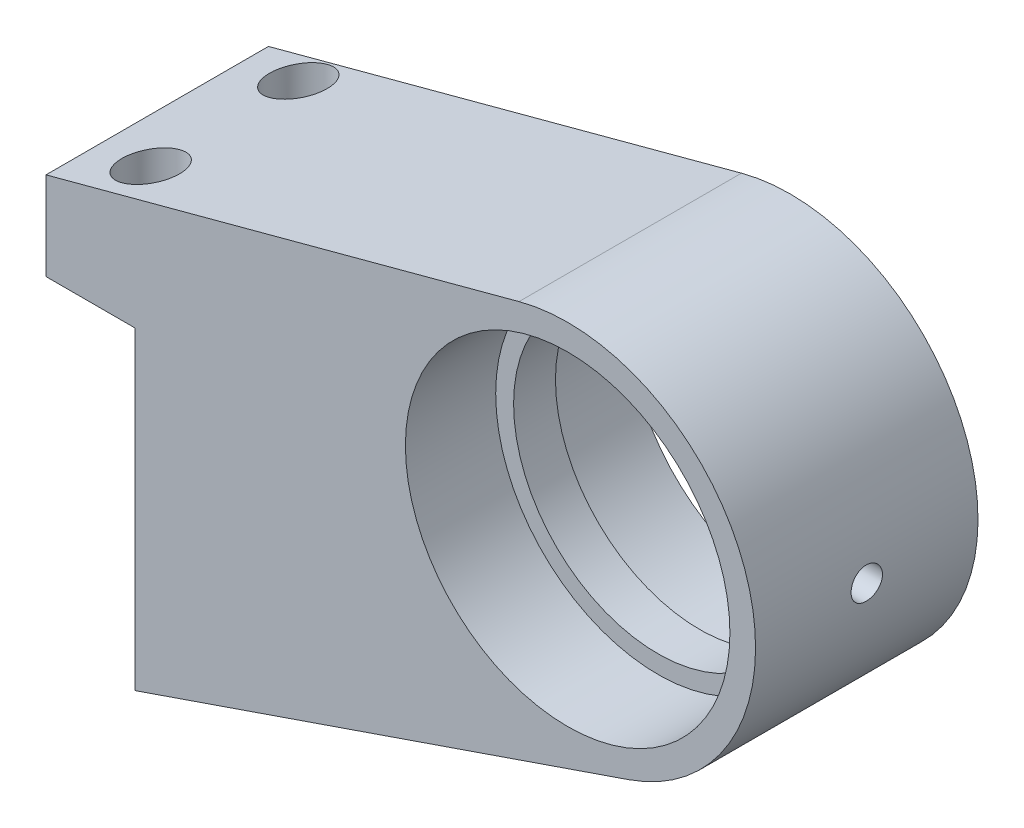
ISO-10303-21;
HEADER;
FILE_DESCRIPTION(('STEP AP214'),'2;1');
FILE_NAME('part.step','',(''),(''),'','','');
FILE_SCHEMA(('AUTOMOTIVE_DESIGN { 1 0 10303 214 1 1 1 1 }'));
ENDSEC;
DATA;
#1=APPLICATION_CONTEXT('core data for automotive mechanical design processes');
#2=APPLICATION_PROTOCOL_DEFINITION('international standard','automotive_design',2000,#1);
#3=PRODUCT_CONTEXT('',#1,'mechanical');
#4=PRODUCT('Part','Part','',(#3));
#5=PRODUCT_RELATED_PRODUCT_CATEGORY('part','',(#4));
#6=PRODUCT_DEFINITION_FORMATION('','',#4);
#7=PRODUCT_DEFINITION_CONTEXT('part definition',#1,'design');
#8=PRODUCT_DEFINITION('design','',#6,#7);
#9=PRODUCT_DEFINITION_SHAPE('','',#8);
#10=(LENGTH_UNIT() NAMED_UNIT(*) SI_UNIT(.MILLI.,.METRE.));
#11=(NAMED_UNIT(*) PLANE_ANGLE_UNIT() SI_UNIT($,.RADIAN.));
#12=(NAMED_UNIT(*) SI_UNIT($,.STERADIAN.) SOLID_ANGLE_UNIT());
#13=UNCERTAINTY_MEASURE_WITH_UNIT(LENGTH_MEASURE(1.E-05),#10,'distance_accuracy_value','');
#14=(GEOMETRIC_REPRESENTATION_CONTEXT(3) GLOBAL_UNCERTAINTY_ASSIGNED_CONTEXT((#13)) GLOBAL_UNIT_ASSIGNED_CONTEXT((#10,
#11,#12)) REPRESENTATION_CONTEXT('',''));
#15=CARTESIAN_POINT('',(0.,0.,0.));
#16=DIRECTION('',(0.,0.,1.));
#17=DIRECTION('',(1.,0.,0.));
#18=AXIS2_PLACEMENT_3D('',#15,#16,#17);
#19=CARTESIAN_POINT('',(0.,0.,21.25));
#20=DIRECTION('',(0.,0.,-1.));
#21=DIRECTION('',(-1.,0.,0.));
#22=AXIS2_PLACEMENT_3D('',#19,#20,#21);
#23=CYLINDRICAL_SURFACE('',#22,35.8999999999999);
#24=CARTESIAN_POINT('',(0.,0.,-21.25));
#25=DIRECTION('',(0.,0.,1.));
#26=DIRECTION('',(-1.,0.,0.));
#27=AXIS2_PLACEMENT_3D('',#24,#25,#26);
#28=CIRCLE('',#27,35.8999999999999);
#29=CARTESIAN_POINT('',(11.6701220456438,-33.9502319791746,-21.25));
#30=VERTEX_POINT('',#29);
#31=CARTESIAN_POINT('',(-9.29160371918065,34.6767371637774,-21.25));
#32=VERTEX_POINT('',#31);
#33=EDGE_CURVE('E95',#30,#32,#28,.T.);
#34=ORIENTED_EDGE('',*,*,#33,.T.);
#35=DIRECTION('',(0.,0.,-1.));
#36=VECTOR('',#35,1.);
#37=CARTESIAN_POINT('',(-9.29160371918065,34.6767371637774,21.25));
#38=LINE('',#37,#36);
#39=CARTESIAN_POINT('',(-9.29160371918065,34.6767371637774,21.25));
#40=VERTEX_POINT('',#39);
#41=EDGE_CURVE('E139',#40,#32,#38,.T.);
#42=ORIENTED_EDGE('',*,*,#41,.F.);
#43=CARTESIAN_POINT('',(0.,0.,21.25));
#44=DIRECTION('',(0.,0.,1.));
#45=DIRECTION('',(-1.,0.,0.));
#46=AXIS2_PLACEMENT_3D('',#43,#44,#45);
#47=CIRCLE('',#46,35.8999999999999);
#48=CARTESIAN_POINT('',(11.6701220456438,-33.9502319791746,21.25));
#49=VERTEX_POINT('',#48);
#50=EDGE_CURVE('E71',#49,#40,#47,.T.);
#51=ORIENTED_EDGE('',*,*,#50,.F.);
#52=DIRECTION('',(0.,0.,-1.));
#53=VECTOR('',#52,1.);
#54=CARTESIAN_POINT('',(11.6701220456438,-33.9502319791746,21.25));
#55=LINE('',#54,#53);
#56=EDGE_CURVE('E135',#49,#30,#55,.T.);
#57=ORIENTED_EDGE('',*,*,#56,.T.);
#58=EDGE_LOOP('',(#34,#42,#51,#57));
#59=FACE_BOUND('',#58,.T.);
#60=CARTESIAN_POINT('',(35.8999999999999,0.,3.));
#61=CARTESIAN_POINT('',(35.8999983581008,-0.168196528062738,2.99999265434154));
#62=CARTESIAN_POINT('',(35.8988053630525,-0.33650751519791,2.98580738391814));
#63=CARTESIAN_POINT('',(35.8941609724885,-0.668472546397986,2.92942846763336));
#64=CARTESIAN_POINT('',(35.8907070193265,-0.832121097171492,2.88720310140622));
#65=CARTESIAN_POINT('',(35.8819310207019,-1.14990533508519,2.7759736788079));
#66=CARTESIAN_POINT('',(35.8766100333074,-1.30404635219412,2.7069847872775));
#67=CARTESIAN_POINT('',(35.8646966645907,-1.59852376156954,2.5442138124416));
#68=CARTESIAN_POINT('',(35.8581045550644,-1.73886309529143,2.45043702778465));
#69=CARTESIAN_POINT('',(35.8443697584854,-2.00214980806945,2.24049279425437));
#70=CARTESIAN_POINT('',(35.837225854699,-2.12505695337023,2.12427496419508));
#71=CARTESIAN_POINT('',(35.8232028398922,-2.34964519784364,1.87285408776642));
#72=CARTESIAN_POINT('',(35.8163237405228,-2.45132536392633,1.73765020725006));
#73=CARTESIAN_POINT('',(35.8035961226238,-2.63070955377057,1.45185150199227));
#74=CARTESIAN_POINT('',(35.7977491297785,-2.70837820839657,1.30123440372215));
#75=CARTESIAN_POINT('',(35.7877616711775,-2.83730871028185,0.989039946665077));
#76=CARTESIAN_POINT('',(35.7836211751275,-2.88857102631902,0.827462782504051));
#77=CARTESIAN_POINT('',(35.7775257367111,-2.96311698654935,0.498337940952735));
#78=CARTESIAN_POINT('',(35.775565674242,-2.98646618610557,0.330805208072192));
#79=CARTESIAN_POINT('',(35.7740368446109,-3.00472563572702,-0.00581204807895169));
#80=CARTESIAN_POINT('',(35.7744680323432,-2.9996364222213,-0.174896542018879));
#81=CARTESIAN_POINT('',(35.7776683320774,-2.96121768905545,-0.509368348073819));
#82=CARTESIAN_POINT('',(35.7804315454105,-2.92795941996716,-0.674763908634743));
#83=CARTESIAN_POINT('',(35.7879752966316,-2.83425735252202,-0.997616989025964));
#84=CARTESIAN_POINT('',(35.7927558543185,-2.77381328735283,-1.1550744309315));
#85=CARTESIAN_POINT('',(35.8038024287285,-2.6273756523904,-1.45780866687739));
#86=CARTESIAN_POINT('',(35.8100703017665,-2.54135012017757,-1.6030699296752));
#87=CARTESIAN_POINT('',(35.82338355671,-2.34621454229857,-1.87711852357911));
#88=CARTESIAN_POINT('',(35.8304289544495,-2.23710402647208,-2.00590551907632));
#89=CARTESIAN_POINT('',(35.8445296523294,-1.99849612477506,-2.24376407056826));
#90=CARTESIAN_POINT('',(35.8515849164053,-1.8689371425196,-2.35277384782563));
#91=CARTESIAN_POINT('',(35.864889771102,-1.59332489395989,-2.5475058983474));
#92=CARTESIAN_POINT('',(35.8711393611806,-1.44727161655407,-2.63322815593788));
#93=CARTESIAN_POINT('',(35.8821299072818,-1.14277650693505,-2.77894799771445));
#94=CARTESIAN_POINT('',(35.8868707025294,-0.984333356713696,-2.83894284065969));
#95=CARTESIAN_POINT('',(35.8943076572108,-0.659574576064503,-2.93146153933016));
#96=CARTESIAN_POINT('',(35.897003859315,-0.493259110007749,-2.96398596836067));
#97=CARTESIAN_POINT('',(35.9000423604596,-0.15801226704986,-3.0005631217943));
#98=CARTESIAN_POINT('',(35.9003917142211,0.010909738561257,-3.00470117757844));
#99=CARTESIAN_POINT('',(35.8987159984715,0.34704509273227,-2.9846116660424));
#100=CARTESIAN_POINT('',(35.8966909512338,0.514258457305466,-2.96038436480736));
#101=CARTESIAN_POINT('',(35.890498709143,0.841986606447021,-2.88432258954828));
#102=CARTESIAN_POINT('',(35.8863345839984,1.00251063470026,-2.83252767291312));
#103=CARTESIAN_POINT('',(35.8763319643611,1.31258976827225,-2.70284134136168));
#104=CARTESIAN_POINT('',(35.8704934432533,1.46214469918688,-2.62494951162485));
#105=CARTESIAN_POINT('',(35.8577789292513,1.74642861467343,-2.44506601571362));
#106=CARTESIAN_POINT('',(35.8509005169244,1.88112172295302,-2.34301782509544));
#107=CARTESIAN_POINT('',(35.836887117496,2.1314963874958,-2.11780002589673));
#108=CARTESIAN_POINT('',(35.8297521259135,2.24717761153615,-1.99463004830072));
#109=CARTESIAN_POINT('',(35.8160088409483,2.4565374853733,-1.7302947105824));
#110=CARTESIAN_POINT('',(35.8094019078717,2.55016044721543,-1.58908516374868));
#111=CARTESIAN_POINT('',(35.7974820694115,2.71236433619843,-1.29289903190053));
#112=CARTESIAN_POINT('',(35.7921691510464,2.78094551456125,-1.13792258501655));
#113=CARTESIAN_POINT('',(35.7834465232229,2.89102423141862,-0.81879897088261));
#114=CARTESIAN_POINT('',(35.7800344198639,2.9325558475408,-0.65466362649774));
#115=CARTESIAN_POINT('',(35.7754917409488,2.98746745470122,-0.321719546728758));
#116=CARTESIAN_POINT('',(35.774361121307,3.0008479897126,-0.152910901712324));
#117=CARTESIAN_POINT('',(35.7745100677143,2.99907130857983,0.184034486825127));
#118=CARTESIAN_POINT('',(35.7757822440027,2.98400159079879,0.352171701905142));
#119=CARTESIAN_POINT('',(35.7805777373763,2.92593464038135,0.683518282301407));
#120=CARTESIAN_POINT('',(35.784101057885,2.88293736527268,0.84672764012297));
#121=CARTESIAN_POINT('',(35.7929999027409,2.77025802096645,1.16359122139991));
#122=CARTESIAN_POINT('',(35.798375316818,2.70057754040981,1.3172460130736));
#123=CARTESIAN_POINT('',(35.8103728493766,2.53651956739625,1.6106907832731));
#124=CARTESIAN_POINT('',(35.8169949484507,2.44214245939094,1.75048097758195));
#125=CARTESIAN_POINT('',(35.8307639244259,2.23104150936917,2.01267618679172));
#126=CARTESIAN_POINT('',(35.8379122847306,2.11425288259286,2.13502896358499));
#127=CARTESIAN_POINT('',(35.8519148030587,1.86176171833654,2.3584449589874));
#128=CARTESIAN_POINT('',(35.8587688894855,1.72605461172823,2.45950301971482));
#129=CARTESIAN_POINT('',(35.8714230113343,1.43931580726634,2.63759716101621));
#130=CARTESIAN_POINT('',(35.8772210522299,1.2882559340769,2.71458797878195));
#131=CARTESIAN_POINT('',(35.8870864246863,0.975407600454834,2.8420141763684));
#132=CARTESIAN_POINT('',(35.8911557441464,0.813631711545144,2.8924800737844));
#133=CARTESIAN_POINT('',(35.8960608059989,0.542418329090169,2.95257473992635));
#134=CARTESIAN_POINT('',(35.8975312767781,0.434724905889867,2.9703355655539));
#135=CARTESIAN_POINT('',(35.8995014047067,0.218037021808156,2.99405056092623));
#136=CARTESIAN_POINT('',(35.9000010644505,0.109042564404451,3.00000476222336));
#137=CARTESIAN_POINT('',(35.8999999999999,0.,3.));
#138=B_SPLINE_CURVE_WITH_KNOTS('',3,(#60,#61,#62,#63,#64,#65,#66,#67,#68,#69,#70,#71,#72,#73,
#74,#75,#76,#77,#78,#79,#80,#81,#82,#83,#84,#85,#86,#87,#88,#89,#90,#91,#92,#93,#94,#95,#96,#97,
#98,#99,#100,#101,#102,#103,#104,#105,#106,#107,#108,#109,#110,#111,#112,#113,#114,#115,#116,
#117,#118,#119,#120,#121,#122,#123,#124,#125,#126,#127,#128,#129,#130,#131,#132,#133,#134,#135,
#136,#137),.UNSPECIFIED.,.T.,.F.,(4,2,2,2,2,2,2,2,2,2,2,2,2,2,2,2,2,2,2,2,2,2,2,2,2,2,2,2,2,2,2,
2,2,2,2,2,2,2,4),(0.,0.504191458804995,1.00895425819109,1.51343146390841,2.01780091989622,
2.52331615795901,3.02885361264998,3.5351322182455,4.04140183583244,4.54648010303825,
5.05154884306913,5.55534386853372,6.05914383855318,6.56357593852548,7.06801831300295,
7.57401027346526,8.0800025744903,8.5860487753091,9.09208441472444,9.59659820717055,
10.1011072669933,10.6048943394815,11.1086894202406,11.613675212063,12.118669827313,
12.6249260012533,13.1311770962361,13.6367891650157,14.1423914635874,14.6464413218599,
15.1504919466938,15.6545125664749,16.1585253406499,16.6640176254706,17.1696322072979,
17.6761920462652,18.182167792402,18.5090382526806,18.8359078394203),.UNSPECIFIED.);
#139=CARTESIAN_POINT('',(35.8999999999999,0.,3.));
#140=VERTEX_POINT('',#139);
#141=EDGE_CURVE('E292',#140,#140,#138,.T.);
#142=ORIENTED_EDGE('',*,*,#141,.F.);
#143=EDGE_LOOP('',(#142));
#144=FACE_BOUND('',#143,.T.);
#145=ADVANCED_FACE('F41',(#59,#144),#23,.T.);
#146=CARTESIAN_POINT('',(0.,0.,-4.));
#147=DIRECTION('',(0.,0.,1.));
#148=DIRECTION('',(1.,0.,0.));
#149=AXIS2_PLACEMENT_3D('',#146,#147,#148);
#150=CYLINDRICAL_SURFACE('',#149,27.58);
#151=CARTESIAN_POINT('',(0.,0.,4.));
#152=DIRECTION('',(0.,0.,-1.));
#153=DIRECTION('',(-1.,0.,0.));
#154=AXIS2_PLACEMENT_3D('',#151,#152,#153);
#155=CIRCLE('',#154,27.58);
#156=CARTESIAN_POINT('',(-27.58,0.,4.));
#157=VERTEX_POINT('',#156);
#158=EDGE_CURVE('E298',#157,#157,#155,.T.);
#159=ORIENTED_EDGE('',*,*,#158,.F.);
#160=EDGE_LOOP('',(#159));
#161=FACE_BOUND('',#160,.T.);
#162=CARTESIAN_POINT('',(0.,0.,-4.));
#163=DIRECTION('',(0.,0.,-1.));
#164=DIRECTION('',(-1.,0.,0.));
#165=AXIS2_PLACEMENT_3D('',#162,#163,#164);
#166=CIRCLE('',#165,27.58);
#167=CARTESIAN_POINT('',(-27.58,0.,-4.));
#168=VERTEX_POINT('',#167);
#169=EDGE_CURVE('E299',#168,#168,#166,.T.);
#170=ORIENTED_EDGE('',*,*,#169,.T.);
#171=EDGE_LOOP('',(#170));
#172=FACE_BOUND('',#171,.T.);
#173=CARTESIAN_POINT('',(27.58,0.,-3.));
#174=CARTESIAN_POINT('',(27.5799979169126,0.167978956027762,-2.99999276752933));
#175=CARTESIAN_POINT('',(27.5784490844313,0.336066990395113,-2.98584401120659));
#176=CARTESIAN_POINT('',(27.5724194323365,0.667577376047584,-2.92961861497622));
#177=CARTESIAN_POINT('',(27.5679354375121,0.830994474354692,-2.88751172971104));
#178=CARTESIAN_POINT('',(27.5565412925159,1.14831481021447,-2.77661527983911));
#179=CARTESIAN_POINT('',(27.549632662861,1.30222393935287,-2.70784243494134));
#180=CARTESIAN_POINT('',(27.5341604053286,1.59628278129557,-2.54560013057423));
#181=CARTESIAN_POINT('',(27.5255970918231,1.73643510012817,-2.45213536106389));
#182=CARTESIAN_POINT('',(27.5077332619421,1.99962574548935,-2.24273947679386));
#183=CARTESIAN_POINT('',(27.4984300949535,2.12259774752127,-2.12672521657018));
#184=CARTESIAN_POINT('',(27.4801568191504,2.34736656558619,-1.8757014273155));
#185=CARTESIAN_POINT('',(27.4711867262493,2.44916237095013,-1.74069099217587));
#186=CARTESIAN_POINT('',(27.4545685551073,2.6289285085869,-1.45508640799281));
#187=CARTESIAN_POINT('',(27.4469238705437,2.70683806100302,-1.30445378828163));
#188=CARTESIAN_POINT('',(27.4338557704664,2.83623202961905,-0.992146736531255));
#189=CARTESIAN_POINT('',(27.4284322905915,2.88771721149684,-0.830472624586383));
#190=CARTESIAN_POINT('',(27.4204451700855,2.96260254108213,-0.501352906241254));
#191=CARTESIAN_POINT('',(27.4178702540291,2.98611344706496,-0.333932779195133));
#192=CARTESIAN_POINT('',(27.4158369964915,3.00472532739131,0.00249533627245889));
#193=CARTESIAN_POINT('',(27.4163785589973,2.99982717696523,0.171503275616218));
#194=CARTESIAN_POINT('',(27.4205067612976,2.96185114894512,0.505543287652069));
#195=CARTESIAN_POINT('',(27.4240802955686,2.92889455026908,0.670589333001444));
#196=CARTESIAN_POINT('',(27.4338493394986,2.8359260190443,0.992793907164186));
#197=CARTESIAN_POINT('',(27.4400448903925,2.77591366100308,1.14995231188936));
#198=CARTESIAN_POINT('',(27.4543749052269,2.63040442180921,1.45230150270226));
#199=CARTESIAN_POINT('',(27.4625134282247,2.54485409440242,1.59746636691849));
#200=CARTESIAN_POINT('',(27.4798090597423,2.35073572193485,1.87142399605327));
#201=CARTESIAN_POINT('',(27.4889662035519,2.24216687928671,2.00021619341446));
#202=CARTESIAN_POINT('',(27.5073256677886,2.00441768190546,2.23847703918632));
#203=CARTESIAN_POINT('',(27.516527974416,1.87513265319938,2.34784126662536));
#204=CARTESIAN_POINT('',(27.5338958922757,1.59998347578554,2.54333117871643));
#205=CARTESIAN_POINT('',(27.5420615019978,1.4541193029245,2.6294568295128));
#206=CARTESIAN_POINT('',(27.5564393969608,1.14987737073765,2.77602199519405));
#207=CARTESIAN_POINT('',(27.5626512485106,0.991496842807074,2.83645580810509));
#208=CARTESIAN_POINT('',(27.5724174858381,0.66675394154955,2.92984320741134));
#209=CARTESIAN_POINT('',(27.5759719656968,0.500391851022112,2.96279776668109));
#210=CARTESIAN_POINT('',(27.5800108384098,0.165312056163207,3.00015779547715));
#211=CARTESIAN_POINT('',(27.5805107175715,-0.00338941244917319,3.00470727649203));
#212=CARTESIAN_POINT('',(27.5784256855577,-0.339152374241956,2.98550683690943));
#213=CARTESIAN_POINT('',(27.575840823842,-0.506213893673539,2.96175737004932));
#214=CARTESIAN_POINT('',(27.5678865643862,-0.833536012420135,2.88675272673352));
#215=CARTESIAN_POINT('',(27.5625240348624,-0.993812336598585,2.83556538386932));
#216=CARTESIAN_POINT('',(27.5496156134477,-1.30350422676063,2.707207984023));
#217=CARTESIAN_POINT('',(27.542069664209,-1.45291950734819,2.63003724457411));
#218=CARTESIAN_POINT('',(27.5255989115081,-1.73729650091566,2.45154934418505));
#219=CARTESIAN_POINT('',(27.5166687811041,-1.87219881234456,2.35013804099338));
#220=CARTESIAN_POINT('',(27.4984477054297,-2.123118195139,2.12618210057457));
#221=CARTESIAN_POINT('',(27.489156749413,-2.23913470350543,2.00363683355327));
#222=CARTESIAN_POINT('',(27.4712141789237,-2.44949280371236,1.74026121561149));
#223=CARTESIAN_POINT('',(27.4625654689757,-2.54373956639787,1.59935489858152));
#224=CARTESIAN_POINT('',(27.4469320659059,-2.70722991532826,1.30362968663849));
#225=CARTESIAN_POINT('',(27.4399473464737,-2.77647389691563,1.14881101175516));
#226=CARTESIAN_POINT('',(27.4284515079905,-2.88783604070959,0.829974740820191));
#227=CARTESIAN_POINT('',(27.4239353347845,-2.93000965847926,0.665976703975508));
#228=CARTESIAN_POINT('',(27.4178726614485,-2.98621344065215,0.333175056996532));
#229=CARTESIAN_POINT('',(27.416326059064,-3.00024457411881,0.164371612535529));
#230=CARTESIAN_POINT('',(27.4163800771123,-2.9997502429502,-0.172306369001562));
#231=CARTESIAN_POINT('',(27.4179642805098,-2.98537373976121,-0.340181147169467));
#232=CARTESIAN_POINT('',(27.4240663129292,-2.92878557776396,-0.671114836671849));
#233=CARTESIAN_POINT('',(27.4285841443937,-2.88657389577827,-0.83417374399619));
#234=CARTESIAN_POINT('',(27.4400396651654,-2.77555655610467,-1.15083979409061));
#235=CARTESIAN_POINT('',(27.4469768714293,-2.70675620671425,-1.30444881639276));
#236=CARTESIAN_POINT('',(27.4624904197263,-2.54452952579609,-1.59796365524847));
#237=CARTESIAN_POINT('',(27.4710667623659,-2.45110318515436,-1.73786946673049));
#238=CARTESIAN_POINT('',(27.4889461648924,-2.24171888720505,-2.00076955269384));
#239=CARTESIAN_POINT('',(27.4982526671643,-2.12564982523075,-2.12367510835964));
#240=CARTESIAN_POINT('',(27.5165126182758,-1.8745002434872,-2.34832661654326));
#241=CARTESIAN_POINT('',(27.5254659824862,-1.73941520157539,-2.45006752164734));
#242=CARTESIAN_POINT('',(27.5420387730814,-1.45362724742756,-2.6297435203285));
#243=CARTESIAN_POINT('',(27.5496542199018,-1.30287979588106,-2.70760809042362));
#244=CARTESIAN_POINT('',(27.5626510969953,-0.990459012076294,-2.8368122774161));
#245=CARTESIAN_POINT('',(27.5680350151705,-0.828798082309856,-2.8881814493931));
#246=CARTESIAN_POINT('',(27.5746271918784,-0.555205540547258,-2.95029364490821));
#247=CARTESIAN_POINT('',(27.5766324638629,-0.445015693166507,-2.96890763506618));
#248=CARTESIAN_POINT('',(27.5793195567694,-0.223233286021933,-2.9937631844421));
#249=CARTESIAN_POINT('',(27.5800013844436,-0.111640733417497,-3.00000480678264));
#250=CARTESIAN_POINT('',(27.58,0.,-3.));
#251=B_SPLINE_CURVE_WITH_KNOTS('',3,(#173,#174,#175,#176,#177,#178,#179,#180,#181,#182,#183,
#184,#185,#186,#187,#188,#189,#190,#191,#192,#193,#194,#195,#196,#197,#198,#199,#200,#201,#202,
#203,#204,#205,#206,#207,#208,#209,#210,#211,#212,#213,#214,#215,#216,#217,#218,#219,#220,#221,
#222,#223,#224,#225,#226,#227,#228,#229,#230,#231,#232,#233,#234,#235,#236,#237,#238,#239,#240,
#241,#242,#243,#244,#245,#246,#247,#248,#249,#250),.UNSPECIFIED.,.T.,.F.,(4,2,2,2,2,2,2,2,2,2,2,
2,2,2,2,2,2,2,2,2,2,2,2,2,2,2,2,2,2,2,2,2,2,2,2,2,2,2,4),(0.,0.503529160366012,1.00760393258812,
1.51136315681138,2.01502676622804,2.52058399745859,3.0261653517122,3.53302270740503,
4.03986537546801,4.54469455696761,5.04950818569814,5.55215083813551,6.05480139565951,
6.55851137230471,7.06223880526228,7.56859673524043,8.07495540291419,8.58142639180485,
9.08787944885294,9.59176273009696,10.0956379323271,10.5982731305,11.1009215316649,
11.6055547094137,12.1102029278792,12.6170095997642,13.1238082577012,13.6295653608777,
14.1353050484228,14.6383998201101,15.1414950107084,15.6444898126553,16.1474848007591,
16.6530129848062,17.1586615909729,17.6657896550256,18.1723507978854,18.5070037383013,
18.8416549713467),.UNSPECIFIED.);
#252=CARTESIAN_POINT('',(27.58,0.,-3.));
#253=VERTEX_POINT('',#252);
#254=EDGE_CURVE('E45',#253,#253,#251,.T.);
#255=ORIENTED_EDGE('',*,*,#254,.T.);
#256=EDGE_LOOP('',(#255));
#257=FACE_BOUND('',#256,.T.);
#258=ADVANCED_FACE('F278',(#161,#172,#257),#150,.F.);
#259=CARTESIAN_POINT('',(0.,0.,21.25));
#260=DIRECTION('',(0.,0.,-1.));
#261=DIRECTION('',(-1.,0.,0.));
#262=AXIS2_PLACEMENT_3D('',#259,#260,#261);
#263=CYLINDRICAL_SURFACE('',#262,30.9999999999999);
#264=CARTESIAN_POINT('',(0.,0.,21.25));
#265=DIRECTION('',(0.,0.,1.));
#266=DIRECTION('',(1.,0.,0.));
#267=AXIS2_PLACEMENT_3D('',#264,#265,#266);
#268=CIRCLE('',#267,30.9999999999999);
#269=CARTESIAN_POINT('',(30.9999999999999,0.,21.25));
#270=VERTEX_POINT('',#269);
#271=EDGE_CURVE('E147',#270,#270,#268,.T.);
#272=ORIENTED_EDGE('',*,*,#271,.T.);
#273=EDGE_LOOP('',(#272));
#274=FACE_BOUND('',#273,.T.);
#275=CARTESIAN_POINT('',(0.,0.,4.));
#276=DIRECTION('',(0.,0.,-1.));
#277=DIRECTION('',(-1.,0.,0.));
#278=AXIS2_PLACEMENT_3D('',#275,#276,#277);
#279=CIRCLE('',#278,31.0000000000008);
#280=CARTESIAN_POINT('',(-31.0000000000008,0.,4.));
#281=VERTEX_POINT('',#280);
#282=EDGE_CURVE('E527',#281,#281,#279,.T.);
#283=ORIENTED_EDGE('',*,*,#282,.T.);
#284=EDGE_LOOP('',(#283));
#285=FACE_BOUND('',#284,.T.);
#286=ADVANCED_FACE('F284',(#274,#285),#263,.F.);
#287=CARTESIAN_POINT('',(0.,0.,21.25));
#288=DIRECTION('',(0.,0.,-1.));
#289=DIRECTION('',(-1.,0.,0.));
#290=AXIS2_PLACEMENT_3D('',#287,#288,#289);
#291=PLANE('',#290);
#292=DIRECTION('',(-0.965925826289067,-0.258819045102526,0.));
#293=VECTOR('',#292,1.);
#294=CARTESIAN_POINT('',(-99.6659125533494,10.4610140951405,21.25));
#295=LINE('',#294,#293);
#296=CARTESIAN_POINT('',(-99.6659125533494,10.4610140951405,21.25));
#297=VERTEX_POINT('',#296);
#298=EDGE_CURVE('E156',#40,#297,#295,.T.);
#299=ORIENTED_EDGE('',*,*,#298,.T.);
#300=DIRECTION('',(0.,-1.,0.));
#301=VECTOR('',#300,1.);
#302=CARTESIAN_POINT('',(-99.6659125533494,10.4610140951405,21.25));
#303=LINE('',#302,#301);
#304=CARTESIAN_POINT('',(-99.6659125533494,-6.37749308736488,21.25));
#305=VERTEX_POINT('',#304);
#306=EDGE_CURVE('E104',#297,#305,#303,.T.);
#307=ORIENTED_EDGE('',*,*,#306,.T.);
#308=DIRECTION('',(1.,0.,0.));
#309=VECTOR('',#308,1.);
#310=CARTESIAN_POINT('',(-99.6659125533494,-6.37749308736488,21.25));
#311=LINE('',#310,#309);
#312=CARTESIAN_POINT('',(-82.6659125533494,-6.37749308736488,21.25));
#313=VERTEX_POINT('',#312);
#314=EDGE_CURVE('E121',#305,#313,#311,.T.);
#315=ORIENTED_EDGE('',*,*,#314,.T.);
#316=DIRECTION('',(0.,-1.,0.));
#317=VECTOR('',#316,1.);
#318=CARTESIAN_POINT('',(-82.6659125533494,-6.37749308736488,21.25));
#319=LINE('',#318,#317);
#320=CARTESIAN_POINT('',(-82.6659125533494,-66.3774930873649,21.25));
#321=VERTEX_POINT('',#320);
#322=EDGE_CURVE('E113',#313,#321,#319,.T.);
#323=ORIENTED_EDGE('',*,*,#322,.T.);
#324=DIRECTION('',(0.945688913068934,0.325073037483115,0.));
#325=VECTOR('',#324,1.);
#326=CARTESIAN_POINT('',(-82.6659125533494,-66.3774930873649,21.25));
#327=LINE('',#326,#325);
#328=EDGE_CURVE('E118',#321,#49,#327,.T.);
#329=ORIENTED_EDGE('',*,*,#328,.T.);
#330=ORIENTED_EDGE('',*,*,#50,.T.);
#331=EDGE_LOOP('',(#299,#307,#315,#323,#329,#330));
#332=FACE_BOUND('',#331,.T.);
#333=ORIENTED_EDGE('',*,*,#271,.F.);
#334=EDGE_LOOP('',(#333));
#335=FACE_BOUND('',#334,.T.);
#336=ADVANCED_FACE('F115',(#332,#335),#291,.F.);
#337=CARTESIAN_POINT('',(0.,0.,-21.25));
#338=DIRECTION('',(0.,0.,-1.));
#339=DIRECTION('',(-1.,0.,0.));
#340=AXIS2_PLACEMENT_3D('',#337,#338,#339);
#341=PLANE('',#340);
#342=DIRECTION('',(-1.,0.,0.));
#343=VECTOR('',#342,1.);
#344=CARTESIAN_POINT('',(8.33408744665062,-36.3774930873649,-21.25));
#345=LINE('',#344,#343);
#346=CARTESIAN_POINT('',(4.60883533632029,-36.3774930873649,-21.25));
#347=VERTEX_POINT('',#346);
#348=CARTESIAN_POINT('',(-82.6659125533494,-36.3774930873649,-21.25));
#349=VERTEX_POINT('',#348);
#350=EDGE_CURVE('E62',#347,#349,#345,.T.);
#351=ORIENTED_EDGE('',*,*,#350,.T.);
#352=DIRECTION('',(0.,-1.,0.));
#353=VECTOR('',#352,1.);
#354=CARTESIAN_POINT('',(-82.6659125533494,-6.37749308736488,-21.25));
#355=LINE('',#354,#353);
#356=CARTESIAN_POINT('',(-82.6659125533494,-6.37749308736488,-21.25));
#357=VERTEX_POINT('',#356);
#358=EDGE_CURVE('E151',#357,#349,#355,.T.);
#359=ORIENTED_EDGE('',*,*,#358,.F.);
#360=DIRECTION('',(1.,0.,0.));
#361=VECTOR('',#360,1.);
#362=CARTESIAN_POINT('',(-99.6659125533494,-6.37749308736488,-21.25));
#363=LINE('',#362,#361);
#364=CARTESIAN_POINT('',(-99.6659125533494,-6.37749308736488,-21.25));
#365=VERTEX_POINT('',#364);
#366=EDGE_CURVE('E149',#365,#357,#363,.T.);
#367=ORIENTED_EDGE('',*,*,#366,.F.);
#368=DIRECTION('',(0.,-1.,0.));
#369=VECTOR('',#368,1.);
#370=CARTESIAN_POINT('',(-99.6659125533494,10.4610140951405,-21.25));
#371=LINE('',#370,#369);
#372=CARTESIAN_POINT('',(-99.6659125533494,10.4610140951405,-21.25));
#373=VERTEX_POINT('',#372);
#374=EDGE_CURVE('E146',#373,#365,#371,.T.);
#375=ORIENTED_EDGE('',*,*,#374,.F.);
#376=DIRECTION('',(-0.965925826289067,-0.258819045102526,0.));
#377=VECTOR('',#376,1.);
#378=CARTESIAN_POINT('',(-99.6659125533494,10.4610140951405,-21.25));
#379=LINE('',#378,#377);
#380=EDGE_CURVE('E143',#32,#373,#379,.T.);
#381=ORIENTED_EDGE('',*,*,#380,.F.);
#382=ORIENTED_EDGE('',*,*,#33,.F.);
#383=DIRECTION('',(0.945688913068934,0.325073037483115,0.));
#384=VECTOR('',#383,1.);
#385=CARTESIAN_POINT('',(-82.6659125533494,-66.3774930873649,-21.25));
#386=LINE('',#385,#384);
#387=EDGE_CURVE('E153',#347,#30,#386,.T.);
#388=ORIENTED_EDGE('',*,*,#387,.F.);
#389=EDGE_LOOP('',(#351,#359,#367,#375,#381,#382,#388));
#390=FACE_BOUND('',#389,.T.);
#391=CARTESIAN_POINT('',(0.,0.,-21.25));
#392=DIRECTION('',(0.,0.,1.));
#393=DIRECTION('',(1.,0.,0.));
#394=AXIS2_PLACEMENT_3D('',#391,#392,#393);
#395=CIRCLE('',#394,30.9999999999999);
#396=CARTESIAN_POINT('',(30.9999999999999,0.,-21.25));
#397=VERTEX_POINT('',#396);
#398=EDGE_CURVE('E213',#397,#397,#395,.T.);
#399=ORIENTED_EDGE('',*,*,#398,.T.);
#400=EDGE_LOOP('',(#399));
#401=FACE_BOUND('',#400,.T.);
#402=ADVANCED_FACE('F227',(#390,#401),#341,.T.);
#403=CARTESIAN_POINT('',(-99.6659125533494,10.4610140951405,21.25));
#404=DIRECTION('',(0.258819045102526,-0.965925826289067,0.));
#405=DIRECTION('',(0.965925826289067,0.258819045102526,0.));
#406=AXIS2_PLACEMENT_3D('',#403,#404,#405);
#407=PLANE('',#406);
#408=CARTESIAN_POINT('',(-87.9659125533494,13.5960196465847,-15.25));
#409=DIRECTION('',(0.258819045102526,-0.965925826289067,0.));
#410=DIRECTION('',(0.965925826289067,0.258819045102526,0.));
#411=AXIS2_PLACEMENT_3D('',#408,#409,#410);
#412=ELLIPSE('',#411,5.69401899225547,5.50000000000001);
#413=CARTESIAN_POINT('',(-82.4659125533494,15.0697402049559,-15.25));
#414=VERTEX_POINT('',#413);
#415=EDGE_CURVE('E171',#414,#414,#412,.T.);
#416=ORIENTED_EDGE('',*,*,#415,.T.);
#417=EDGE_LOOP('',(#416));
#418=FACE_BOUND('',#417,.T.);
#419=CARTESIAN_POINT('',(-87.9659125533494,13.5960196465847,12.95));
#420=DIRECTION('',(0.258819045102526,-0.965925826289067,0.));
#421=DIRECTION('',(0.965925826289067,0.258819045102526,0.));
#422=AXIS2_PLACEMENT_3D('',#419,#420,#421);
#423=ELLIPSE('',#422,5.69401899225547,5.50000000000001);
#424=CARTESIAN_POINT('',(-82.4659125533494,15.0697402049559,12.95));
#425=VERTEX_POINT('',#424);
#426=EDGE_CURVE('E166',#425,#425,#423,.T.);
#427=ORIENTED_EDGE('',*,*,#426,.T.);
#428=EDGE_LOOP('',(#427));
#429=FACE_BOUND('',#428,.T.);
#430=ORIENTED_EDGE('',*,*,#380,.T.);
#431=DIRECTION('',(0.,0.,-1.));
#432=VECTOR('',#431,1.);
#433=CARTESIAN_POINT('',(-99.6659125533494,10.4610140951405,21.25));
#434=LINE('',#433,#432);
#435=EDGE_CURVE('E163',#297,#373,#434,.T.);
#436=ORIENTED_EDGE('',*,*,#435,.F.);
#437=ORIENTED_EDGE('',*,*,#298,.F.);
#438=ORIENTED_EDGE('',*,*,#41,.T.);
#439=EDGE_LOOP('',(#430,#436,#437,#438));
#440=FACE_BOUND('',#439,.T.);
#441=ADVANCED_FACE('F43',(#418,#429,#440),#407,.F.);
#442=CARTESIAN_POINT('',(-99.6659125533494,10.4610140951405,21.25));
#443=DIRECTION('',(1.,0.,0.));
#444=DIRECTION('',(0.,0.,-1.));
#445=AXIS2_PLACEMENT_3D('',#442,#443,#444);
#446=PLANE('',#445);
#447=ORIENTED_EDGE('',*,*,#374,.T.);
#448=DIRECTION('',(0.,0.,-1.));
#449=VECTOR('',#448,1.);
#450=CARTESIAN_POINT('',(-99.6659125533494,-6.37749308736488,21.25));
#451=LINE('',#450,#449);
#452=EDGE_CURVE('E160',#305,#365,#451,.T.);
#453=ORIENTED_EDGE('',*,*,#452,.F.);
#454=ORIENTED_EDGE('',*,*,#306,.F.);
#455=ORIENTED_EDGE('',*,*,#435,.T.);
#456=EDGE_LOOP('',(#447,#453,#454,#455));
#457=FACE_BOUND('',#456,.T.);
#458=ADVANCED_FACE('F221',(#457),#446,.F.);
#459=CARTESIAN_POINT('',(-99.6659125533494,-6.37749308736488,21.25));
#460=DIRECTION('',(0.,1.,0.));
#461=DIRECTION('',(-1.,0.,0.));
#462=AXIS2_PLACEMENT_3D('',#459,#460,#461);
#463=PLANE('',#462);
#464=CARTESIAN_POINT('',(-87.9659125533494,-6.37749308736488,-15.25));
#465=DIRECTION('',(0.,1.,0.));
#466=DIRECTION('',(-1.,0.,0.));
#467=AXIS2_PLACEMENT_3D('',#464,#465,#466);
#468=CIRCLE('',#467,3.25);
#469=CARTESIAN_POINT('',(-91.2159125533494,-6.37749308736488,-15.25));
#470=VERTEX_POINT('',#469);
#471=EDGE_CURVE('E174',#470,#470,#468,.T.);
#472=ORIENTED_EDGE('',*,*,#471,.T.);
#473=EDGE_LOOP('',(#472));
#474=FACE_BOUND('',#473,.T.);
#475=CARTESIAN_POINT('',(-87.9659125533494,-6.37749308736488,12.95));
#476=DIRECTION('',(0.,1.,0.));
#477=DIRECTION('',(-1.,0.,0.));
#478=AXIS2_PLACEMENT_3D('',#475,#476,#477);
#479=CIRCLE('',#478,3.25);
#480=CARTESIAN_POINT('',(-91.2159125533494,-6.37749308736488,12.95));
#481=VERTEX_POINT('',#480);
#482=EDGE_CURVE('E170',#481,#481,#479,.T.);
#483=ORIENTED_EDGE('',*,*,#482,.T.);
#484=EDGE_LOOP('',(#483));
#485=FACE_BOUND('',#484,.T.);
#486=ORIENTED_EDGE('',*,*,#366,.T.);
#487=DIRECTION('',(0.,0.,-1.));
#488=VECTOR('',#487,1.);
#489=CARTESIAN_POINT('',(-82.6659125533494,-6.37749308736488,21.25));
#490=LINE('',#489,#488);
#491=EDGE_CURVE('E134',#313,#357,#490,.T.);
#492=ORIENTED_EDGE('',*,*,#491,.F.);
#493=ORIENTED_EDGE('',*,*,#314,.F.);
#494=ORIENTED_EDGE('',*,*,#452,.T.);
#495=EDGE_LOOP('',(#486,#492,#493,#494));
#496=FACE_BOUND('',#495,.T.);
#497=ADVANCED_FACE('F224',(#474,#485,#496),#463,.F.);
#498=CARTESIAN_POINT('',(-82.6659125533494,-6.37749308736488,21.25));
#499=DIRECTION('',(1.,0.,0.));
#500=DIRECTION('',(0.,1.,0.));
#501=AXIS2_PLACEMENT_3D('',#498,#499,#500);
#502=PLANE('',#501);
#503=CARTESIAN_POINT('',(-82.6659125533494,-60.6774930873649,15.68));
#504=DIRECTION('',(-1.,0.,0.));
#505=DIRECTION('',(0.,0.,1.));
#506=AXIS2_PLACEMENT_3D('',#503,#504,#505);
#507=CIRCLE('',#506,2.49999999999999);
#508=CARTESIAN_POINT('',(-82.6659125533494,-60.6774930873649,18.18));
#509=VERTEX_POINT('',#508);
#510=EDGE_CURVE('E169',#509,#509,#507,.T.);
#511=ORIENTED_EDGE('',*,*,#510,.F.);
#512=EDGE_LOOP('',(#511));
#513=FACE_BOUND('',#512,.T.);
#514=CARTESIAN_POINT('',(-82.6659125533494,-36.6774930873649,15.68));
#515=DIRECTION('',(-1.,0.,0.));
#516=DIRECTION('',(0.,0.,1.));
#517=AXIS2_PLACEMENT_3D('',#514,#515,#516);
#518=CIRCLE('',#517,2.49999999999999);
#519=CARTESIAN_POINT('',(-82.6659125533494,-36.6774930873649,18.18));
#520=VERTEX_POINT('',#519);
#521=EDGE_CURVE('E199',#520,#520,#518,.T.);
#522=ORIENTED_EDGE('',*,*,#521,.F.);
#523=EDGE_LOOP('',(#522));
#524=FACE_BOUND('',#523,.T.);
#525=CARTESIAN_POINT('',(-82.6659125533494,-44.6774930873649,0.68));
#526=DIRECTION('',(-1.,0.,0.));
#527=DIRECTION('',(0.,0.,1.));
#528=AXIS2_PLACEMENT_3D('',#525,#526,#527);
#529=CIRCLE('',#528,2.49999999999999);
#530=CARTESIAN_POINT('',(-82.6659125533494,-44.6774930873649,3.17999999999999));
#531=VERTEX_POINT('',#530);
#532=EDGE_CURVE('E205',#531,#531,#529,.T.);
#533=ORIENTED_EDGE('',*,*,#532,.F.);
#534=EDGE_LOOP('',(#533));
#535=FACE_BOUND('',#534,.T.);
#536=ORIENTED_EDGE('',*,*,#358,.T.);
#537=DIRECTION('',(0.,0.707106781186547,-0.707106781186548));
#538=VECTOR('',#537,1.);
#539=CARTESIAN_POINT('',(-82.6659125533494,-36.3774930873649,-21.25));
#540=LINE('',#539,#538);
#541=CARTESIAN_POINT('',(-82.6659125533494,-66.3774930873649,8.75));
#542=VERTEX_POINT('',#541);
#543=EDGE_CURVE('E132',#542,#349,#540,.T.);
#544=ORIENTED_EDGE('',*,*,#543,.F.);
#545=DIRECTION('',(0.,0.,-1.));
#546=VECTOR('',#545,1.);
#547=CARTESIAN_POINT('',(-82.6659125533494,-66.3774930873649,21.25));
#548=LINE('',#547,#546);
#549=EDGE_CURVE('E128',#321,#542,#548,.T.);
#550=ORIENTED_EDGE('',*,*,#549,.F.);
#551=ORIENTED_EDGE('',*,*,#322,.F.);
#552=ORIENTED_EDGE('',*,*,#491,.T.);
#553=EDGE_LOOP('',(#536,#544,#550,#551,#552));
#554=FACE_BOUND('',#553,.T.);
#555=ADVANCED_FACE('F130',(#513,#524,#535,#554),#502,.F.);
#556=CARTESIAN_POINT('',(-82.6659125533494,-66.3774930873649,21.25));
#557=DIRECTION('',(-0.325073037483115,0.945688913068934,0.));
#558=DIRECTION('',(-0.945688913068934,-0.325073037483115,0.));
#559=AXIS2_PLACEMENT_3D('',#556,#557,#558);
#560=PLANE('',#559);
#561=ORIENTED_EDGE('',*,*,#549,.T.);
#562=DIRECTION('',(0.899363063939663,0.309148895535034,-0.309148895535034));
#563=VECTOR('',#562,1.);
#564=CARTESIAN_POINT('',(-86.1413762771237,-67.5721560824965,9.94466299513165));
#565=LINE('',#564,#563);
#566=EDGE_CURVE('E55',#542,#347,#565,.T.);
#567=ORIENTED_EDGE('',*,*,#566,.T.);
#568=ORIENTED_EDGE('',*,*,#387,.T.);
#569=ORIENTED_EDGE('',*,*,#56,.F.);
#570=ORIENTED_EDGE('',*,*,#328,.F.);
#571=EDGE_LOOP('',(#561,#567,#568,#569,#570));
#572=FACE_BOUND('',#571,.T.);
#573=ADVANCED_FACE('F137',(#572),#560,.F.);
#574=CARTESIAN_POINT('',(0.,0.,-4.));
#575=DIRECTION('',(0.,0.,-1.));
#576=DIRECTION('',(-1.,0.,0.));
#577=AXIS2_PLACEMENT_3D('',#574,#575,#576);
#578=CIRCLE('',#577,30.9999999999999);
#579=CARTESIAN_POINT('',(-30.9999999999999,0.,-4.));
#580=VERTEX_POINT('',#579);
#581=EDGE_CURVE('E11',#580,#580,#578,.T.);
#582=ORIENTED_EDGE('',*,*,#581,.F.);
#583=EDGE_LOOP('',(#582));
#584=FACE_BOUND('',#583,.T.);
#585=ORIENTED_EDGE('',*,*,#398,.F.);
#586=EDGE_LOOP('',(#585));
#587=FACE_BOUND('',#586,.T.);
#588=ADVANCED_FACE('F417',(#584,#587),#263,.F.);
#589=CARTESIAN_POINT('',(8.33408744665062,-36.3774930873649,-21.25));
#590=DIRECTION('',(0.,0.707106781186548,0.707106781186547));
#591=DIRECTION('',(0.,-0.707106781186547,0.707106781186548));
#592=AXIS2_PLACEMENT_3D('',#589,#590,#591);
#593=PLANE('',#592);
#594=ORIENTED_EDGE('',*,*,#543,.T.);
#595=ORIENTED_EDGE('',*,*,#350,.F.);
#596=ORIENTED_EDGE('',*,*,#566,.F.);
#597=EDGE_LOOP('',(#594,#595,#596));
#598=FACE_BOUND('',#597,.T.);
#599=ADVANCED_FACE('F273',(#598),#593,.F.);
#600=CARTESIAN_POINT('',(-74.6659125533494,-44.6774930873649,0.68));
#601=DIRECTION('',(-1.,0.,0.));
#602=DIRECTION('',(0.,0.,1.));
#603=AXIS2_PLACEMENT_3D('',#600,#601,#602);
#604=CONICAL_SURFACE('',#603,2.49999999999999,1.02974425867665);
#605=CARTESIAN_POINT('',(-73.1637610057805,-44.6774930873649,0.68));
#606=VERTEX_POINT('',#605);
#607=VERTEX_LOOP('',#606);
#608=FACE_BOUND('',#607,.T.);
#609=CARTESIAN_POINT('',(-74.6659125533494,-44.6774930873649,0.68));
#610=DIRECTION('',(-1.,0.,0.));
#611=DIRECTION('',(0.,0.,1.));
#612=AXIS2_PLACEMENT_3D('',#609,#610,#611);
#613=CIRCLE('',#612,2.49999999999999);
#614=CARTESIAN_POINT('',(-74.6659125533494,-44.6774930873649,3.17999999999999));
#615=VERTEX_POINT('',#614);
#616=EDGE_CURVE('E208',#615,#615,#613,.T.);
#617=ORIENTED_EDGE('',*,*,#616,.T.);
#618=EDGE_LOOP('',(#617));
#619=FACE_BOUND('',#618,.T.);
#620=ADVANCED_FACE('F264',(#608,#619),#604,.F.);
#621=CARTESIAN_POINT('',(-82.6659125533494,-44.6774930873649,0.68));
#622=DIRECTION('',(-1.,0.,0.));
#623=DIRECTION('',(0.,0.,1.));
#624=AXIS2_PLACEMENT_3D('',#621,#622,#623);
#625=CYLINDRICAL_SURFACE('',#624,2.49999999999999);
#626=ORIENTED_EDGE('',*,*,#616,.F.);
#627=EDGE_LOOP('',(#626));
#628=FACE_BOUND('',#627,.T.);
#629=ORIENTED_EDGE('',*,*,#532,.T.);
#630=EDGE_LOOP('',(#629));
#631=FACE_BOUND('',#630,.T.);
#632=ADVANCED_FACE('F261',(#628,#631),#625,.F.);
#633=CARTESIAN_POINT('',(-74.6659125533494,-36.6774930873649,15.68));
#634=DIRECTION('',(-1.,0.,0.));
#635=DIRECTION('',(0.,0.,1.));
#636=AXIS2_PLACEMENT_3D('',#633,#634,#635);
#637=CONICAL_SURFACE('',#636,2.49999999999999,1.02974425867665);
#638=CARTESIAN_POINT('',(-73.1637610057805,-36.6774930873649,15.68));
#639=VERTEX_POINT('',#638);
#640=VERTEX_LOOP('',#639);
#641=FACE_BOUND('',#640,.T.);
#642=CARTESIAN_POINT('',(-74.6659125533494,-36.6774930873649,15.68));
#643=DIRECTION('',(-1.,0.,0.));
#644=DIRECTION('',(0.,0.,1.));
#645=AXIS2_PLACEMENT_3D('',#642,#643,#644);
#646=CIRCLE('',#645,2.49999999999999);
#647=CARTESIAN_POINT('',(-74.6659125533494,-36.6774930873649,18.18));
#648=VERTEX_POINT('',#647);
#649=EDGE_CURVE('E202',#648,#648,#646,.T.);
#650=ORIENTED_EDGE('',*,*,#649,.T.);
#651=EDGE_LOOP('',(#650));
#652=FACE_BOUND('',#651,.T.);
#653=ADVANCED_FACE('F263',(#641,#652),#637,.F.);
#654=CARTESIAN_POINT('',(-82.6659125533494,-36.6774930873649,15.68));
#655=DIRECTION('',(-1.,0.,0.));
#656=DIRECTION('',(0.,0.,1.));
#657=AXIS2_PLACEMENT_3D('',#654,#655,#656);
#658=CYLINDRICAL_SURFACE('',#657,2.49999999999999);
#659=ORIENTED_EDGE('',*,*,#649,.F.);
#660=EDGE_LOOP('',(#659));
#661=FACE_BOUND('',#660,.T.);
#662=ORIENTED_EDGE('',*,*,#521,.T.);
#663=EDGE_LOOP('',(#662));
#664=FACE_BOUND('',#663,.T.);
#665=ADVANCED_FACE('F244',(#661,#664),#658,.F.);
#666=CARTESIAN_POINT('',(-74.6659125533494,-60.6774930873649,15.68));
#667=DIRECTION('',(-1.,0.,0.));
#668=DIRECTION('',(0.,0.,1.));
#669=AXIS2_PLACEMENT_3D('',#666,#667,#668);
#670=CONICAL_SURFACE('',#669,2.49999999999999,1.02974425867665);
#671=CARTESIAN_POINT('',(-73.1637610057805,-60.6774930873649,15.68));
#672=VERTEX_POINT('',#671);
#673=VERTEX_LOOP('',#672);
#674=FACE_BOUND('',#673,.T.);
#675=CARTESIAN_POINT('',(-74.6659125533494,-60.6774930873649,15.68));
#676=DIRECTION('',(-1.,0.,0.));
#677=DIRECTION('',(0.,0.,1.));
#678=AXIS2_PLACEMENT_3D('',#675,#676,#677);
#679=CIRCLE('',#678,2.49999999999999);
#680=CARTESIAN_POINT('',(-74.6659125533494,-60.6774930873649,18.18));
#681=VERTEX_POINT('',#680);
#682=EDGE_CURVE('E196',#681,#681,#679,.T.);
#683=ORIENTED_EDGE('',*,*,#682,.T.);
#684=EDGE_LOOP('',(#683));
#685=FACE_BOUND('',#684,.T.);
#686=ADVANCED_FACE('F240',(#674,#685),#670,.F.);
#687=CARTESIAN_POINT('',(-82.6659125533494,-60.6774930873649,15.68));
#688=DIRECTION('',(-1.,0.,0.));
#689=DIRECTION('',(0.,0.,1.));
#690=AXIS2_PLACEMENT_3D('',#687,#688,#689);
#691=CYLINDRICAL_SURFACE('',#690,2.49999999999999);
#692=ORIENTED_EDGE('',*,*,#682,.F.);
#693=EDGE_LOOP('',(#692));
#694=FACE_BOUND('',#693,.T.);
#695=ORIENTED_EDGE('',*,*,#510,.T.);
#696=EDGE_LOOP('',(#695));
#697=FACE_BOUND('',#696,.T.);
#698=ADVANCED_FACE('F243',(#694,#697),#691,.F.);
#699=CARTESIAN_POINT('',(-87.9659125533494,17.6225069126351,12.95));
#700=DIRECTION('',(0.,1.,0.));
#701=DIRECTION('',(0.,0.,1.));
#702=AXIS2_PLACEMENT_3D('',#699,#700,#701);
#703=CYLINDRICAL_SURFACE('',#702,5.50000000000001);
#704=CARTESIAN_POINT('',(-87.9659125533494,4.62250691263513,12.95));
#705=DIRECTION('',(0.,1.,0.));
#706=DIRECTION('',(0.,0.,1.));
#707=AXIS2_PLACEMENT_3D('',#704,#705,#706);
#708=CIRCLE('',#707,5.50000000000001);
#709=CARTESIAN_POINT('',(-87.9659125533494,4.62250691263513,18.45));
#710=VERTEX_POINT('',#709);
#711=EDGE_CURVE('E173',#710,#710,#708,.T.);
#712=ORIENTED_EDGE('',*,*,#711,.F.);
#713=EDGE_LOOP('',(#712));
#714=FACE_BOUND('',#713,.T.);
#715=ORIENTED_EDGE('',*,*,#426,.F.);
#716=EDGE_LOOP('',(#715));
#717=FACE_BOUND('',#716,.T.);
#718=ADVANCED_FACE('F250',(#714,#717),#703,.F.);
#719=CARTESIAN_POINT('',(-87.9659125533494,17.6225069126351,12.95));
#720=DIRECTION('',(0.,1.,0.));
#721=DIRECTION('',(0.,0.,1.));
#722=AXIS2_PLACEMENT_3D('',#719,#720,#721);
#723=CYLINDRICAL_SURFACE('',#722,3.25);
#724=ORIENTED_EDGE('',*,*,#482,.F.);
#725=EDGE_LOOP('',(#724));
#726=FACE_BOUND('',#725,.T.);
#727=CARTESIAN_POINT('',(-87.9659125533494,4.62250691263513,12.95));
#728=DIRECTION('',(0.,1.,0.));
#729=DIRECTION('',(0.,0.,1.));
#730=AXIS2_PLACEMENT_3D('',#727,#728,#729);
#731=CIRCLE('',#730,3.25);
#732=CARTESIAN_POINT('',(-87.9659125533494,4.62250691263513,16.2));
#733=VERTEX_POINT('',#732);
#734=EDGE_CURVE('E178',#733,#733,#731,.T.);
#735=ORIENTED_EDGE('',*,*,#734,.T.);
#736=EDGE_LOOP('',(#735));
#737=FACE_BOUND('',#736,.T.);
#738=ADVANCED_FACE('F330',(#726,#737),#723,.F.);
#739=CARTESIAN_POINT('',(-84.7159125533494,4.62250691263513,12.95));
#740=DIRECTION('',(0.,-1.,0.));
#741=DIRECTION('',(0.,0.,-1.));
#742=AXIS2_PLACEMENT_3D('',#739,#740,#741);
#743=PLANE('',#742);
#744=ORIENTED_EDGE('',*,*,#734,.F.);
#745=EDGE_LOOP('',(#744));
#746=FACE_BOUND('',#745,.T.);
#747=ORIENTED_EDGE('',*,*,#711,.T.);
#748=EDGE_LOOP('',(#747));
#749=FACE_BOUND('',#748,.T.);
#750=ADVANCED_FACE('F320',(#746,#749),#743,.F.);
#751=CARTESIAN_POINT('',(-87.9659125533494,17.6225069126351,-15.25));
#752=DIRECTION('',(0.,1.,0.));
#753=DIRECTION('',(0.,0.,1.));
#754=AXIS2_PLACEMENT_3D('',#751,#752,#753);
#755=CYLINDRICAL_SURFACE('',#754,5.50000000000001);
#756=CARTESIAN_POINT('',(-87.9659125533494,4.62250691263513,-15.25));
#757=DIRECTION('',(0.,1.,0.));
#758=DIRECTION('',(0.,0.,1.));
#759=AXIS2_PLACEMENT_3D('',#756,#757,#758);
#760=CIRCLE('',#759,5.50000000000001);
#761=CARTESIAN_POINT('',(-87.9659125533494,4.62250691263513,-9.75));
#762=VERTEX_POINT('',#761);
#763=EDGE_CURVE('E186',#762,#762,#760,.T.);
#764=ORIENTED_EDGE('',*,*,#763,.F.);
#765=EDGE_LOOP('',(#764));
#766=FACE_BOUND('',#765,.T.);
#767=ORIENTED_EDGE('',*,*,#415,.F.);
#768=EDGE_LOOP('',(#767));
#769=FACE_BOUND('',#768,.T.);
#770=ADVANCED_FACE('F316',(#766,#769),#755,.F.);
#771=CARTESIAN_POINT('',(-87.9659125533494,17.6225069126351,-15.25));
#772=DIRECTION('',(0.,1.,0.));
#773=DIRECTION('',(0.,0.,1.));
#774=AXIS2_PLACEMENT_3D('',#771,#772,#773);
#775=CYLINDRICAL_SURFACE('',#774,3.25);
#776=ORIENTED_EDGE('',*,*,#471,.F.);
#777=EDGE_LOOP('',(#776));
#778=FACE_BOUND('',#777,.T.);
#779=CARTESIAN_POINT('',(-87.9659125533494,4.62250691263513,-15.25));
#780=DIRECTION('',(0.,1.,0.));
#781=DIRECTION('',(0.,0.,1.));
#782=AXIS2_PLACEMENT_3D('',#779,#780,#781);
#783=CIRCLE('',#782,3.25);
#784=CARTESIAN_POINT('',(-87.9659125533494,4.62250691263513,-12.));
#785=VERTEX_POINT('',#784);
#786=EDGE_CURVE('E181',#785,#785,#783,.T.);
#787=ORIENTED_EDGE('',*,*,#786,.T.);
#788=EDGE_LOOP('',(#787));
#789=FACE_BOUND('',#788,.T.);
#790=ADVANCED_FACE('F319',(#778,#789),#775,.F.);
#791=CARTESIAN_POINT('',(-84.7159125533494,4.62250691263513,-15.25));
#792=DIRECTION('',(0.,-1.,0.));
#793=DIRECTION('',(0.,0.,-1.));
#794=AXIS2_PLACEMENT_3D('',#791,#792,#793);
#795=PLANE('',#794);
#796=ORIENTED_EDGE('',*,*,#786,.F.);
#797=EDGE_LOOP('',(#796));
#798=FACE_BOUND('',#797,.T.);
#799=ORIENTED_EDGE('',*,*,#763,.T.);
#800=EDGE_LOOP('',(#799));
#801=FACE_BOUND('',#800,.T.);
#802=ADVANCED_FACE('F312',(#798,#801),#795,.F.);
#803=CARTESIAN_POINT('',(0.,0.,-4.));
#804=DIRECTION('',(0.,0.,-1.));
#805=DIRECTION('',(-1.,0.,0.));
#806=AXIS2_PLACEMENT_3D('',#803,#804,#805);
#807=PLANE('',#806);
#808=ORIENTED_EDGE('',*,*,#581,.T.);
#809=EDGE_LOOP('',(#808));
#810=FACE_BOUND('',#809,.T.);
#811=ORIENTED_EDGE('',*,*,#169,.F.);
#812=EDGE_LOOP('',(#811));
#813=FACE_BOUND('',#812,.T.);
#814=ADVANCED_FACE('F309',(#810,#813),#807,.T.);
#815=CARTESIAN_POINT('',(0.,0.,4.));
#816=DIRECTION('',(0.,0.,-1.));
#817=DIRECTION('',(-1.,0.,0.));
#818=AXIS2_PLACEMENT_3D('',#815,#816,#817);
#819=PLANE('',#818);
#820=ORIENTED_EDGE('',*,*,#282,.F.);
#821=EDGE_LOOP('',(#820));
#822=FACE_BOUND('',#821,.T.);
#823=ORIENTED_EDGE('',*,*,#158,.T.);
#824=EDGE_LOOP('',(#823));
#825=FACE_BOUND('',#824,.T.);
#826=ADVANCED_FACE('F304',(#822,#825),#819,.F.);
#827=CARTESIAN_POINT('',(35.8999999999999,0.,0.));
#828=DIRECTION('',(-1.,0.,0.));
#829=DIRECTION('',(0.,0.,1.));
#830=AXIS2_PLACEMENT_3D('',#827,#828,#829);
#831=CYLINDRICAL_SURFACE('',#830,3.);
#832=ORIENTED_EDGE('',*,*,#254,.F.);
#833=EDGE_LOOP('',(#832));
#834=FACE_BOUND('',#833,.T.);
#835=ORIENTED_EDGE('',*,*,#141,.T.);
#836=EDGE_LOOP('',(#835));
#837=FACE_BOUND('',#836,.T.);
#838=ADVANCED_FACE('F301',(#834,#837),#831,.F.);
#839=CLOSED_SHELL('',(#145,#258,#286,#336,#402,#441,#458,#497,#555,#573,#588,#599,#620,#632,
#653,#665,#686,#698,#718,#738,#750,#770,#790,#802,#814,#826,#838));
#840=MANIFOLD_SOLID_BREP('B2',#839);
#841=ADVANCED_BREP_SHAPE_REPRESENTATION('',(#18,#840),#14);
#842=SHAPE_DEFINITION_REPRESENTATION(#9,#841);
ENDSEC;
END-ISO-10303-21;
